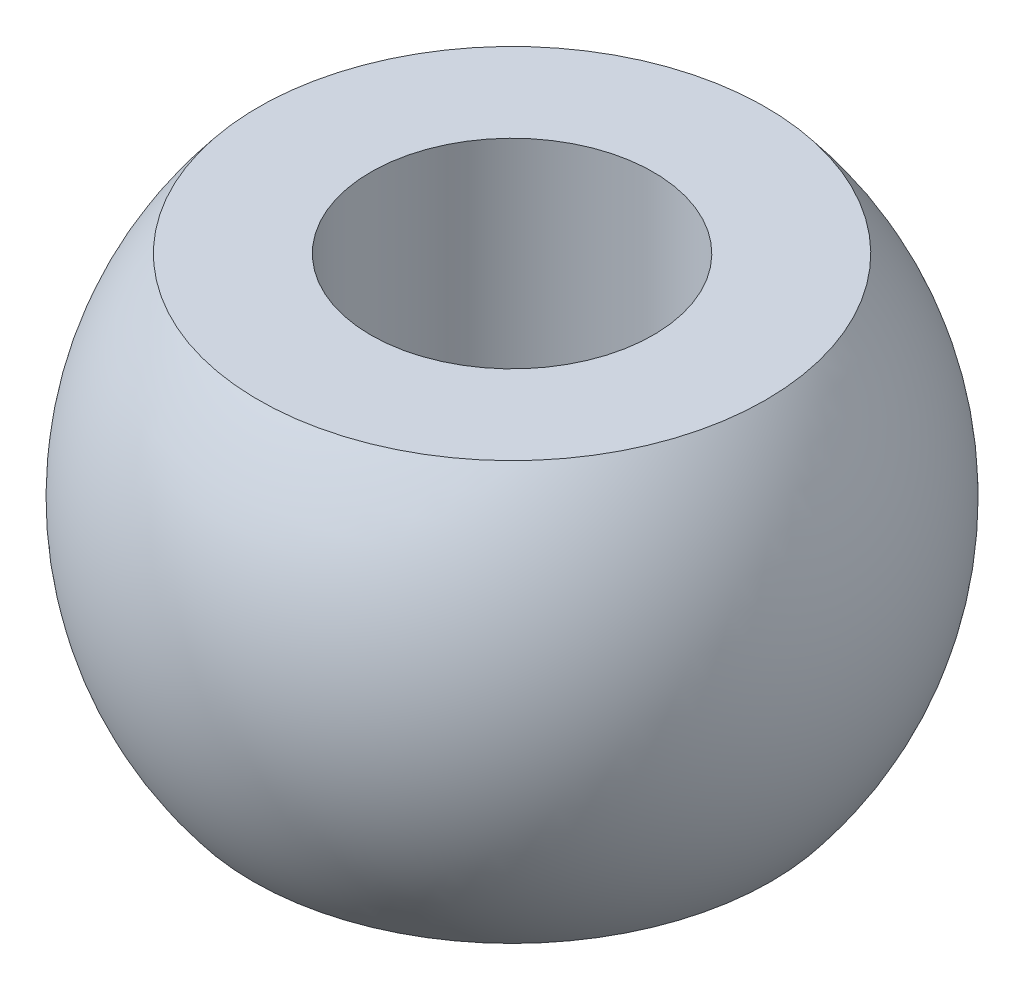
ISO-10303-21;
HEADER;
FILE_DESCRIPTION(('STEP AP214'),'2;1');
FILE_NAME('part.step','',(''),(''),'','','');
FILE_SCHEMA(('AUTOMOTIVE_DESIGN { 1 0 10303 214 1 1 1 1 }'));
ENDSEC;
DATA;
#1=APPLICATION_CONTEXT('core data for automotive mechanical design processes');
#2=APPLICATION_PROTOCOL_DEFINITION('international standard','automotive_design',2000,#1);
#3=PRODUCT_CONTEXT('',#1,'mechanical');
#4=PRODUCT('Part','Part','',(#3));
#5=PRODUCT_RELATED_PRODUCT_CATEGORY('part','',(#4));
#6=PRODUCT_DEFINITION_FORMATION('','',#4);
#7=PRODUCT_DEFINITION_CONTEXT('part definition',#1,'design');
#8=PRODUCT_DEFINITION('design','',#6,#7);
#9=PRODUCT_DEFINITION_SHAPE('','',#8);
#10=(LENGTH_UNIT() NAMED_UNIT(*) SI_UNIT(.MILLI.,.METRE.));
#11=(NAMED_UNIT(*) PLANE_ANGLE_UNIT() SI_UNIT($,.RADIAN.));
#12=(NAMED_UNIT(*) SI_UNIT($,.STERADIAN.) SOLID_ANGLE_UNIT());
#13=UNCERTAINTY_MEASURE_WITH_UNIT(LENGTH_MEASURE(1.E-05),#10,'distance_accuracy_value','');
#14=(GEOMETRIC_REPRESENTATION_CONTEXT(3) GLOBAL_UNCERTAINTY_ASSIGNED_CONTEXT((#13)) GLOBAL_UNIT_ASSIGNED_CONTEXT((#10,
#11,#12)) REPRESENTATION_CONTEXT('',''));
#15=CARTESIAN_POINT('',(0.,0.,0.));
#16=DIRECTION('',(0.,0.,1.));
#17=DIRECTION('',(1.,0.,0.));
#18=AXIS2_PLACEMENT_3D('',#15,#16,#17);
#19=CARTESIAN_POINT('',(1.5,-0.365063509461095,0.));
#20=DIRECTION('',(0.,1.,0.));
#21=DIRECTION('',(0.,0.,1.));
#22=AXIS2_PLACEMENT_3D('',#19,#20,#21);
#23=PLANE('',#22);
#24=CARTESIAN_POINT('',(0.,-0.365063509461095,0.));
#25=DIRECTION('',(0.,1.,0.));
#26=DIRECTION('',(0.,0.,1.));
#27=AXIS2_PLACEMENT_3D('',#24,#25,#26);
#28=CIRCLE('',#27,2.25);
#29=CARTESIAN_POINT('',(0.,-0.365063509461095,2.25));
#30=VERTEX_POINT('',#29);
#31=EDGE_CURVE('E10',#30,#30,#28,.T.);
#32=ORIENTED_EDGE('',*,*,#31,.F.);
#33=EDGE_LOOP('',(#32));
#34=FACE_BOUND('',#33,.T.);
#35=CARTESIAN_POINT('',(0.,-0.365063509461095,0.));
#36=DIRECTION('',(0.,1.,0.));
#37=DIRECTION('',(0.,0.,1.));
#38=AXIS2_PLACEMENT_3D('',#35,#36,#37);
#39=CIRCLE('',#38,1.5);
#40=CARTESIAN_POINT('',(0.,-0.365063509461095,1.5));
#41=VERTEX_POINT('',#40);
#42=EDGE_CURVE('E53',#41,#41,#39,.T.);
#43=ORIENTED_EDGE('',*,*,#42,.T.);
#44=EDGE_LOOP('',(#43));
#45=FACE_BOUND('',#44,.T.);
#46=ADVANCED_FACE('F31',(#34,#45),#23,.F.);
#47=CARTESIAN_POINT('',(0.,2.94102902432511,0.));
#48=DIRECTION('',(0.,1.,0.));
#49=DIRECTION('',(0.,0.,1.));
#50=AXIS2_PLACEMENT_3D('',#47,#48,#49);
#51=CYLINDRICAL_SURFACE('',#50,2.25);
#52=CARTESIAN_POINT('',(0.,-2.1650635094611,0.));
#53=DIRECTION('',(0.,1.,0.));
#54=DIRECTION('',(0.,0.,1.));
#55=AXIS2_PLACEMENT_3D('',#52,#53,#54);
#56=CIRCLE('',#55,2.25);
#57=CARTESIAN_POINT('',(0.,-2.1650635094611,2.25));
#58=VERTEX_POINT('',#57);
#59=EDGE_CURVE('E37',#58,#58,#56,.T.);
#60=ORIENTED_EDGE('',*,*,#59,.F.);
#61=EDGE_LOOP('',(#60));
#62=FACE_BOUND('',#61,.T.);
#63=ORIENTED_EDGE('',*,*,#31,.T.);
#64=EDGE_LOOP('',(#63));
#65=FACE_BOUND('',#64,.T.);
#66=ADVANCED_FACE('F78',(#62,#65),#51,.F.);
#67=CARTESIAN_POINT('',(2.25,-2.1650635094611,0.));
#68=DIRECTION('',(0.,1.,0.));
#69=DIRECTION('',(0.,0.,1.));
#70=AXIS2_PLACEMENT_3D('',#67,#68,#69);
#71=PLANE('',#70);
#72=CARTESIAN_POINT('',(0.,-2.1650635094611,0.));
#73=DIRECTION('',(0.,1.,0.));
#74=DIRECTION('',(0.,0.,1.));
#75=AXIS2_PLACEMENT_3D('',#72,#73,#74);
#76=CIRCLE('',#75,2.75);
#77=CARTESIAN_POINT('',(2.75,-2.1650635094611,0.));
#78=VERTEX_POINT('',#77);
#79=EDGE_CURVE('E41',#78,#78,#76,.T.);
#80=ORIENTED_EDGE('',*,*,#79,.F.);
#81=EDGE_LOOP('',(#80));
#82=FACE_BOUND('',#81,.T.);
#83=ORIENTED_EDGE('',*,*,#59,.T.);
#84=EDGE_LOOP('',(#83));
#85=FACE_BOUND('',#84,.T.);
#86=ADVANCED_FACE('F73',(#82,#85),#71,.F.);
#87=CARTESIAN_POINT('',(0.,0.,0.));
#88=DIRECTION('',(0.,1.,0.));
#89=DIRECTION('',(1.,0.,0.));
#90=AXIS2_PLACEMENT_3D('',#87,#88,#89);
#91=SPHERICAL_SURFACE('',#90,3.5);
#92=CARTESIAN_POINT('',(0.,2.2349364905389,0.));
#93=DIRECTION('',(0.,1.,0.));
#94=DIRECTION('',(0.,0.,1.));
#95=AXIS2_PLACEMENT_3D('',#92,#93,#94);
#96=CIRCLE('',#95,2.69352165078687);
#97=CARTESIAN_POINT('',(2.69352165078687,2.2349364905389,0.));
#98=VERTEX_POINT('',#97);
#99=EDGE_CURVE('E45',#98,#98,#96,.T.);
#100=CARTESIAN_POINT('',(2.69352165078687,2.2349364905389,0.));
#101=CARTESIAN_POINT('',(2.72517362617501,2.19679093494784,0.));
#102=CARTESIAN_POINT('',(2.75601419704314,2.15797218565184,0.));
#103=CARTESIAN_POINT('',(2.81601925386955,2.07906017461047,0.));
#104=CARTESIAN_POINT('',(2.84518373982785,2.03896691286509,0.));
#105=CARTESIAN_POINT('',(2.9017833509648,1.95757775188548,0.));
#106=CARTESIAN_POINT('',(2.92921847614346,1.91628185265124,0.));
#107=CARTESIAN_POINT('',(2.98231002158793,1.83256207855069,0.));
#108=CARTESIAN_POINT('',(3.00796644185374,1.79013820368438,0.));
#109=CARTESIAN_POINT('',(3.05745422639163,1.70423901081635,0.));
#110=CARTESIAN_POINT('',(3.0812855906637,1.66076369281462,0.));
#111=CARTESIAN_POINT('',(3.12708026422336,1.57284008808873,0.));
#112=CARTESIAN_POINT('',(3.14904357351094,1.52839180136456,0.));
#113=CARTESIAN_POINT('',(3.19106249401782,1.43860247778142,0.));
#114=CARTESIAN_POINT('',(3.21111810523713,1.39326144092245,0.));
#115=CARTESIAN_POINT('',(3.24928543375082,1.30176845008655,0.));
#116=CARTESIAN_POINT('',(3.2673971510452,1.25561649610962,0.));
#117=CARTESIAN_POINT('',(3.3016440031087,1.16258496676158,0.));
#118=CARTESIAN_POINT('',(3.31777913787782,1.11570539139047,0.));
#119=CARTESIAN_POINT('',(3.34804370396327,1.0213032284306,0.));
#120=CARTESIAN_POINT('',(3.36217313527962,0.973780640841828,0.));
#121=CARTESIAN_POINT('',(3.38840079338248,0.8781782230824,0.));
#122=CARTESIAN_POINT('',(3.40049902016901,0.830098392911743,0.));
#123=CARTESIAN_POINT('',(3.42264243411239,0.733468265362459,0.));
#124=CARTESIAN_POINT('',(3.43268762126924,0.684917967983833,0.));
#125=CARTESIAN_POINT('',(3.45070682621173,0.587434530496095,0.));
#126=CARTESIAN_POINT('',(3.45868084399735,0.538501390386982,0.));
#127=CARTESIAN_POINT('',(3.4725433185423,0.440340582878603,0.));
#128=CARTESIAN_POINT('',(3.47843177530163,0.391112915479335,0.));
#129=CARTESIAN_POINT('',(3.48811250019776,0.292451900398982,0.));
#130=CARTESIAN_POINT('',(3.49190476833457,0.243018552717896,0.));
#131=CARTESIAN_POINT('',(3.49738627162974,0.144035395297923,0.));
#132=CARTESIAN_POINT('',(3.4990755067881,0.0944855855590354,0.));
#133=CARTESIAN_POINT('',(3.50034789536336,-0.00464106755966409,0.));
#134=CARTESIAN_POINT('',(3.49993104878027,-0.0542179109394758,0.));
#135=CARTESIAN_POINT('',(3.4969920262051,-0.153309154132327,0.));
#136=CARTESIAN_POINT('',(3.49446985021302,-0.202823553945366,0.));
#137=CARTESIAN_POINT('',(3.48732472088993,-0.301700545496266,0.));
#138=CARTESIAN_POINT('',(3.48270176755891,-0.351063137234125,0.));
#139=CARTESIAN_POINT('',(3.47136342715007,-0.449547422112372,0.));
#140=CARTESIAN_POINT('',(3.46464804007224,-0.49866911525276,0.));
#141=CARTESIAN_POINT('',(3.44913695222475,-0.596582947191728,0.));
#142=CARTESIAN_POINT('',(3.44034125145509,-0.645375085990309,0.));
#143=CARTESIAN_POINT('',(3.4206854108693,-0.742541748288262,0.));
#144=CARTESIAN_POINT('',(3.40982527105316,-0.790916271787634,0.));
#145=CARTESIAN_POINT('',(3.38606015295181,-0.887160396245379,0.));
#146=CARTESIAN_POINT('',(3.3731551746666,-0.935029997203752,0.));
#147=CARTESIAN_POINT('',(3.34532367078889,-1.0301778806471,0.));
#148=CARTESIAN_POINT('',(3.3303971451964,-1.07745616313208,0.));
#149=CARTESIAN_POINT('',(3.29854948631015,-1.17133608085978,0.));
#150=CARTESIAN_POINT('',(3.28162835301638,-1.21793771610249,0.));
#151=CARTESIAN_POINT('',(3.24582201854435,-1.31038023202264,0.));
#152=CARTESIAN_POINT('',(3.22693681736607,-1.35622111270007,0.));
#153=CARTESIAN_POINT('',(3.18723643058694,-1.44705938436829,0.));
#154=CARTESIAN_POINT('',(3.16642124498609,-1.49205677535908,0.));
#155=CARTESIAN_POINT('',(3.12289846035385,-1.58112685794738,0.));
#156=CARTESIAN_POINT('',(3.10019086132247,-1.62519954954489,0.));
#157=CARTESIAN_POINT('',(3.05292422039159,-1.71234068110146,0.));
#158=CARTESIAN_POINT('',(3.02836517849209,-1.75540912106051,0.));
#159=CARTESIAN_POINT('',(2.97744002321768,-1.84046405233088,0.));
#160=CARTESIAN_POINT('',(2.95107390984278,-1.88245054364219,0.));
#161=CARTESIAN_POINT('',(2.89658202309162,-1.96526567380643,0.));
#162=CARTESIAN_POINT('',(2.86845624971537,-2.00609431265935,0.));
#163=CARTESIAN_POINT('',(2.81049645641011,-2.08652051915541,0.));
#164=CARTESIAN_POINT('',(2.7806624364811,-2.12611808679854,0.));
#165=CARTESIAN_POINT('',(2.75,-2.1650635094611,0.));
#166=B_SPLINE_CURVE_WITH_KNOTS('',3,(#100,#101,#102,#103,#104,#105,#106,#107,#108,#109,#110,
#111,#112,#113,#114,#115,#116,#117,#118,#119,#120,#121,#122,#123,#124,#125,#126,#127,#128,#129,
#130,#131,#132,#133,#134,#135,#136,#137,#138,#139,#140,#141,#142,#143,#144,#145,#146,#147,#148,
#149,#150,#151,#152,#153,#154,#155,#156,#157,#158,#159,#160,#161,#162,#163,#164,#165),
.UNSPECIFIED.,.F.,.F.,(4,2,2,2,2,2,2,2,2,2,2,2,2,2,2,2,2,2,2,2,2,2,2,2,2,2,2,2,2,2,2,2,4),(0.,
0.148691047186939,0.297382094373878,0.446073141560816,0.594764188747755,0.743455235934694,
0.892146283121632,1.04083733030857,1.18952837749551,1.33821942468245,1.48691047186939,
1.63560151905633,1.78429256624326,1.9329836134302,2.08167466061714,2.23036570780408,
2.37905675499102,2.52774780217796,2.6764388493649,2.82512989655184,2.97382094373878,
3.12251199092571,3.27120303811265,3.41989408529959,3.56858513248653,3.71727617967347,
3.86596722686041,4.01465827404735,4.16334932123428,4.31204036842122,4.46073141560816,
4.6094224627951,4.75811350998204),.UNSPECIFIED.);
#167=EDGE_CURVE('BSEAM67',#98,#78,#166,.T.);
#168=ORIENTED_EDGE('',*,*,#99,.F.);
#169=ORIENTED_EDGE('',*,*,#79,.T.);
#170=ORIENTED_EDGE('',*,*,#167,.T.);
#171=ORIENTED_EDGE('',*,*,#167,.F.);
#172=EDGE_LOOP('',(#168,#170,#169,#171));
#173=FACE_BOUND('',#172,.T.);
#174=ADVANCED_FACE('F67',(#173),#91,.T.);
#175=CARTESIAN_POINT('',(1.5,2.2349364905389,0.));
#176=DIRECTION('',(0.,-1.,0.));
#177=DIRECTION('',(0.,0.,-1.));
#178=AXIS2_PLACEMENT_3D('',#175,#176,#177);
#179=PLANE('',#178);
#180=CARTESIAN_POINT('',(0.,2.2349364905389,0.));
#181=DIRECTION('',(0.,1.,0.));
#182=DIRECTION('',(0.,0.,1.));
#183=AXIS2_PLACEMENT_3D('',#180,#181,#182);
#184=CIRCLE('',#183,1.5);
#185=CARTESIAN_POINT('',(0.,2.2349364905389,1.5));
#186=VERTEX_POINT('',#185);
#187=EDGE_CURVE('E50',#186,#186,#184,.T.);
#188=ORIENTED_EDGE('',*,*,#187,.F.);
#189=EDGE_LOOP('',(#188));
#190=FACE_BOUND('',#189,.T.);
#191=ORIENTED_EDGE('',*,*,#99,.T.);
#192=EDGE_LOOP('',(#191));
#193=FACE_BOUND('',#192,.T.);
#194=ADVANCED_FACE('F61',(#190,#193),#179,.F.);
#195=CARTESIAN_POINT('',(0.,2.94102902432511,0.));
#196=DIRECTION('',(0.,1.,0.));
#197=DIRECTION('',(0.,0.,1.));
#198=AXIS2_PLACEMENT_3D('',#195,#196,#197);
#199=CYLINDRICAL_SURFACE('',#198,1.5);
#200=ORIENTED_EDGE('',*,*,#42,.F.);
#201=EDGE_LOOP('',(#200));
#202=FACE_BOUND('',#201,.T.);
#203=ORIENTED_EDGE('',*,*,#187,.T.);
#204=EDGE_LOOP('',(#203));
#205=FACE_BOUND('',#204,.T.);
#206=ADVANCED_FACE('F58',(#202,#205),#199,.F.);
#207=CLOSED_SHELL('',(#46,#66,#86,#174,#194,#206));
#208=MANIFOLD_SOLID_BREP('B2',#207);
#209=ADVANCED_BREP_SHAPE_REPRESENTATION('',(#18,#208),#14);
#210=SHAPE_DEFINITION_REPRESENTATION(#9,#209);
ENDSEC;
END-ISO-10303-21;
